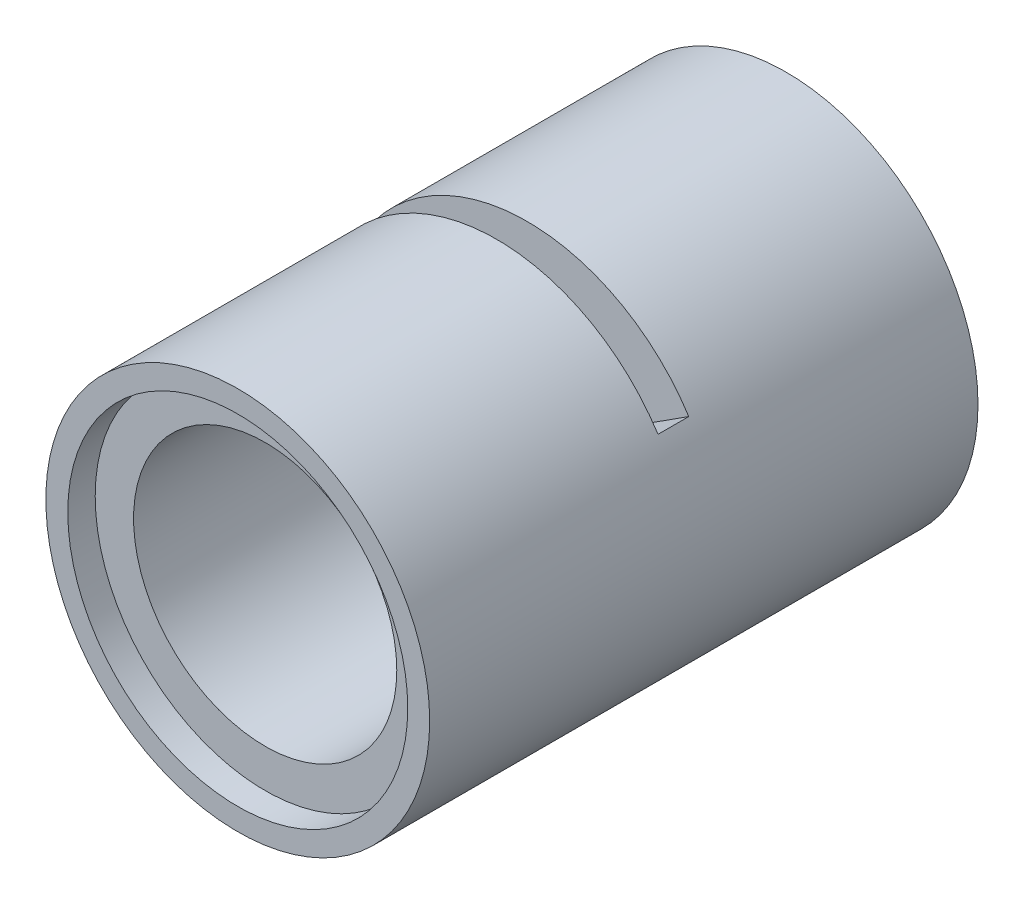
ISO-10303-21;
HEADER;
FILE_DESCRIPTION(('STEP AP214'),'2;1');
FILE_NAME('part.step','',(''),(''),'','','');
FILE_SCHEMA(('AUTOMOTIVE_DESIGN { 1 0 10303 214 1 1 1 1 }'));
ENDSEC;
DATA;
#1=APPLICATION_CONTEXT('core data for automotive mechanical design processes');
#2=APPLICATION_PROTOCOL_DEFINITION('international standard','automotive_design',2000,#1);
#3=PRODUCT_CONTEXT('',#1,'mechanical');
#4=PRODUCT('Part','Part','',(#3));
#5=PRODUCT_RELATED_PRODUCT_CATEGORY('part','',(#4));
#6=PRODUCT_DEFINITION_FORMATION('','',#4);
#7=PRODUCT_DEFINITION_CONTEXT('part definition',#1,'design');
#8=PRODUCT_DEFINITION('design','',#6,#7);
#9=PRODUCT_DEFINITION_SHAPE('','',#8);
#10=(LENGTH_UNIT() NAMED_UNIT(*) SI_UNIT(.MILLI.,.METRE.));
#11=(NAMED_UNIT(*) PLANE_ANGLE_UNIT() SI_UNIT($,.RADIAN.));
#12=(NAMED_UNIT(*) SI_UNIT($,.STERADIAN.) SOLID_ANGLE_UNIT());
#13=UNCERTAINTY_MEASURE_WITH_UNIT(LENGTH_MEASURE(1.E-05),#10,'distance_accuracy_value','');
#14=(GEOMETRIC_REPRESENTATION_CONTEXT(3) GLOBAL_UNCERTAINTY_ASSIGNED_CONTEXT((#13)) GLOBAL_UNIT_ASSIGNED_CONTEXT((#10,
#11,#12)) REPRESENTATION_CONTEXT('',''));
#15=CARTESIAN_POINT('',(0.,0.,0.));
#16=DIRECTION('',(0.,0.,1.));
#17=DIRECTION('',(1.,0.,0.));
#18=AXIS2_PLACEMENT_3D('',#15,#16,#17);
#19=CARTESIAN_POINT('',(0.,0.,0.));
#20=DIRECTION('',(0.,0.,1.));
#21=DIRECTION('',(1.,0.,0.));
#22=AXIS2_PLACEMENT_3D('',#19,#20,#21);
#23=CYLINDRICAL_SURFACE('',#22,2.4);
#24=CARTESIAN_POINT('',(0.,0.,9.5));
#25=DIRECTION('',(0.,0.,1.));
#26=DIRECTION('',(1.,0.,0.));
#27=AXIS2_PLACEMENT_3D('',#24,#25,#26);
#28=CIRCLE('',#27,2.4);
#29=CARTESIAN_POINT('',(2.4,0.,9.5));
#30=VERTEX_POINT('',#29);
#31=EDGE_CURVE('E146',#30,#30,#28,.F.);
#32=ORIENTED_EDGE('',*,*,#31,.F.);
#33=EDGE_LOOP('',(#32));
#34=FACE_BOUND('',#33,.T.);
#35=CARTESIAN_POINT('',(0.,0.,0.5));
#36=DIRECTION('',(0.,0.,-1.));
#37=DIRECTION('',(-1.,0.,0.));
#38=AXIS2_PLACEMENT_3D('',#35,#36,#37);
#39=CIRCLE('',#38,2.4);
#40=CARTESIAN_POINT('',(-2.4,0.,0.5));
#41=VERTEX_POINT('',#40);
#42=EDGE_CURVE('E63',#41,#41,#39,.F.);
#43=ORIENTED_EDGE('',*,*,#42,.F.);
#44=EDGE_LOOP('',(#43));
#45=FACE_BOUND('',#44,.T.);
#46=ADVANCED_FACE('F59',(#34,#45),#23,.F.);
#47=CARTESIAN_POINT('',(0.,0.,10.));
#48=DIRECTION('',(0.,0.,-1.));
#49=DIRECTION('',(-1.,0.,0.));
#50=AXIS2_PLACEMENT_3D('',#47,#48,#49);
#51=CYLINDRICAL_SURFACE('',#50,3.5);
#52=CARTESIAN_POINT('',(0.,0.,5.28033941216112));
#53=DIRECTION('',(0.,0.,-1.));
#54=DIRECTION('',(0.841470984807896,0.54030230586814,0.));
#55=AXIS2_PLACEMENT_3D('',#52,#53,#54);
#56=CIRCLE('',#55,3.5);
#57=CARTESIAN_POINT('',(-2.94514844682764,1.89105807053849,5.28033941216112));
#58=VERTEX_POINT('',#57);
#59=CARTESIAN_POINT('',(2.94514844682764,1.89105807053849,5.28033941216112));
#60=VERTEX_POINT('',#59);
#61=EDGE_CURVE('E106',#58,#60,#56,.T.);
#62=ORIENTED_EDGE('',*,*,#61,.F.);
#63=DIRECTION('',(0.,0.,1.));
#64=VECTOR('',#63,1.);
#65=CARTESIAN_POINT('',(-2.94514844682764,1.89105807053849,4.71966058783888));
#66=LINE('',#65,#64);
#67=CARTESIAN_POINT('',(-2.94514844682764,1.89105807053849,4.71966058783888));
#68=VERTEX_POINT('',#67);
#69=EDGE_CURVE('E206',#68,#58,#66,.T.);
#70=ORIENTED_EDGE('',*,*,#69,.F.);
#71=CARTESIAN_POINT('',(0.,0.,4.71966058783888));
#72=DIRECTION('',(0.,0.,-1.));
#73=DIRECTION('',(0.841470984807896,0.54030230586814,0.));
#74=AXIS2_PLACEMENT_3D('',#71,#72,#73);
#75=CIRCLE('',#74,3.5);
#76=CARTESIAN_POINT('',(2.94514844682764,1.89105807053849,4.71966058783888));
#77=VERTEX_POINT('',#76);
#78=EDGE_CURVE('E212',#68,#77,#75,.T.);
#79=ORIENTED_EDGE('',*,*,#78,.T.);
#80=DIRECTION('',(0.,0.,-1.));
#81=VECTOR('',#80,1.);
#82=CARTESIAN_POINT('',(2.94514844682764,1.89105807053849,5.28033941216112));
#83=LINE('',#82,#81);
#84=EDGE_CURVE('E76',#60,#77,#83,.T.);
#85=ORIENTED_EDGE('',*,*,#84,.F.);
#86=EDGE_LOOP('',(#62,#70,#79,#85));
#87=FACE_BOUND('',#86,.T.);
#88=CARTESIAN_POINT('',(0.,0.,10.));
#89=DIRECTION('',(0.,0.,1.));
#90=DIRECTION('',(1.,0.,0.));
#91=AXIS2_PLACEMENT_3D('',#88,#89,#90);
#92=CIRCLE('',#91,3.5);
#93=CARTESIAN_POINT('',(3.5,0.,10.));
#94=VERTEX_POINT('',#93);
#95=EDGE_CURVE('E13',#94,#94,#92,.T.);
#96=ORIENTED_EDGE('',*,*,#95,.F.);
#97=EDGE_LOOP('',(#96));
#98=FACE_BOUND('',#97,.T.);
#99=CARTESIAN_POINT('',(0.,0.,0.));
#100=DIRECTION('',(0.,0.,1.));
#101=DIRECTION('',(1.,0.,0.));
#102=AXIS2_PLACEMENT_3D('',#99,#100,#101);
#103=CIRCLE('',#102,3.5);
#104=CARTESIAN_POINT('',(3.5,0.,0.));
#105=VERTEX_POINT('',#104);
#106=EDGE_CURVE('E68',#105,#105,#103,.T.);
#107=ORIENTED_EDGE('',*,*,#106,.T.);
#108=EDGE_LOOP('',(#107));
#109=FACE_BOUND('',#108,.T.);
#110=ADVANCED_FACE('F61',(#87,#98,#109),#51,.T.);
#111=CARTESIAN_POINT('',(0.,0.,10.));
#112=DIRECTION('',(0.,0.,1.));
#113=DIRECTION('',(1.,0.,0.));
#114=AXIS2_PLACEMENT_3D('',#111,#112,#113);
#115=PLANE('',#114);
#116=CARTESIAN_POINT('',(0.,0.,10.));
#117=DIRECTION('',(0.,0.,1.));
#118=DIRECTION('',(1.,0.,0.));
#119=AXIS2_PLACEMENT_3D('',#116,#117,#118);
#120=CIRCLE('',#119,3.1);
#121=CARTESIAN_POINT('',(3.1,0.,10.));
#122=VERTEX_POINT('',#121);
#123=EDGE_CURVE('E147',#122,#122,#120,.T.);
#124=ORIENTED_EDGE('',*,*,#123,.F.);
#125=EDGE_LOOP('',(#124));
#126=FACE_BOUND('',#125,.T.);
#127=ORIENTED_EDGE('',*,*,#95,.T.);
#128=EDGE_LOOP('',(#127));
#129=FACE_BOUND('',#128,.T.);
#130=ADVANCED_FACE('F185',(#126,#129),#115,.T.);
#131=CARTESIAN_POINT('',(0.,0.,0.));
#132=DIRECTION('',(0.,0.,1.));
#133=DIRECTION('',(1.,0.,0.));
#134=AXIS2_PLACEMENT_3D('',#131,#132,#133);
#135=PLANE('',#134);
#136=CARTESIAN_POINT('',(0.,0.,0.));
#137=DIRECTION('',(0.,0.,1.));
#138=DIRECTION('',(1.,0.,0.));
#139=AXIS2_PLACEMENT_3D('',#136,#137,#138);
#140=CIRCLE('',#139,3.1);
#141=CARTESIAN_POINT('',(3.1,0.,0.));
#142=VERTEX_POINT('',#141);
#143=EDGE_CURVE('E136',#142,#142,#140,.T.);
#144=ORIENTED_EDGE('',*,*,#143,.T.);
#145=EDGE_LOOP('',(#144));
#146=FACE_BOUND('',#145,.T.);
#147=ORIENTED_EDGE('',*,*,#106,.F.);
#148=EDGE_LOOP('',(#147));
#149=FACE_BOUND('',#148,.T.);
#150=ADVANCED_FACE('F182',(#146,#149),#135,.F.);
#151=CARTESIAN_POINT('',(0.,0.,9.5));
#152=DIRECTION('',(0.,0.,1.));
#153=DIRECTION('',(1.,0.,0.));
#154=AXIS2_PLACEMENT_3D('',#151,#152,#153);
#155=PLANE('',#154);
#156=CARTESIAN_POINT('',(0.,0.,9.5));
#157=DIRECTION('',(0.,0.,1.));
#158=DIRECTION('',(1.,0.,0.));
#159=AXIS2_PLACEMENT_3D('',#156,#157,#158);
#160=CIRCLE('',#159,3.1);
#161=CARTESIAN_POINT('',(3.1,0.,9.5));
#162=VERTEX_POINT('',#161);
#163=EDGE_CURVE('E143',#162,#162,#160,.T.);
#164=ORIENTED_EDGE('',*,*,#163,.T.);
#165=EDGE_LOOP('',(#164));
#166=FACE_BOUND('',#165,.T.);
#167=ORIENTED_EDGE('',*,*,#31,.T.);
#168=EDGE_LOOP('',(#167));
#169=FACE_BOUND('',#168,.T.);
#170=ADVANCED_FACE('F154',(#166,#169),#155,.T.);
#171=CARTESIAN_POINT('',(0.,0.,9.5));
#172=DIRECTION('',(0.,0.,1.));
#173=DIRECTION('',(1.,0.,0.));
#174=AXIS2_PLACEMENT_3D('',#171,#172,#173);
#175=CYLINDRICAL_SURFACE('',#174,3.1);
#176=ORIENTED_EDGE('',*,*,#163,.F.);
#177=EDGE_LOOP('',(#176));
#178=FACE_BOUND('',#177,.T.);
#179=ORIENTED_EDGE('',*,*,#123,.T.);
#180=EDGE_LOOP('',(#179));
#181=FACE_BOUND('',#180,.T.);
#182=ADVANCED_FACE('F165',(#178,#181),#175,.F.);
#183=CARTESIAN_POINT('',(0.,0.,0.5));
#184=DIRECTION('',(0.,0.,-1.));
#185=DIRECTION('',(1.,0.,0.));
#186=AXIS2_PLACEMENT_3D('',#183,#184,#185);
#187=PLANE('',#186);
#188=CARTESIAN_POINT('',(0.,0.,0.5));
#189=DIRECTION('',(0.,0.,1.));
#190=DIRECTION('',(1.,0.,0.));
#191=AXIS2_PLACEMENT_3D('',#188,#189,#190);
#192=CIRCLE('',#191,3.1);
#193=CARTESIAN_POINT('',(3.1,0.,0.5));
#194=VERTEX_POINT('',#193);
#195=EDGE_CURVE('E138',#194,#194,#192,.T.);
#196=ORIENTED_EDGE('',*,*,#195,.F.);
#197=EDGE_LOOP('',(#196));
#198=FACE_BOUND('',#197,.T.);
#199=ORIENTED_EDGE('',*,*,#42,.T.);
#200=EDGE_LOOP('',(#199));
#201=FACE_BOUND('',#200,.T.);
#202=ADVANCED_FACE('F162',(#198,#201),#187,.T.);
#203=CARTESIAN_POINT('',(0.,0.,0.5));
#204=DIRECTION('',(0.,0.,-1.));
#205=DIRECTION('',(-1.,0.,0.));
#206=AXIS2_PLACEMENT_3D('',#203,#204,#205);
#207=CYLINDRICAL_SURFACE('',#206,3.1);
#208=ORIENTED_EDGE('',*,*,#195,.T.);
#209=EDGE_LOOP('',(#208));
#210=FACE_BOUND('',#209,.T.);
#211=ORIENTED_EDGE('',*,*,#143,.F.);
#212=EDGE_LOOP('',(#211));
#213=FACE_BOUND('',#212,.T.);
#214=ADVANCED_FACE('F164',(#210,#213),#207,.F.);
#215=CARTESIAN_POINT('',(-2.94514844682764,1.89105807053849,5.));
#216=DIRECTION('',(-0.540302305868139,-0.841470984807897,0.));
#217=DIRECTION('',(0.,0.,1.));
#218=AXIS2_PLACEMENT_3D('',#215,#216,#217);
#219=PLANE('',#218);
#220=DIRECTION('',(-0.841470984807897,0.540302305868139,0.));
#221=VECTOR('',#220,1.);
#222=CARTESIAN_POINT('',(-2.94514844682764,1.89105807053849,4.71966058783888));
#223=LINE('',#222,#221);
#224=CARTESIAN_POINT('',(-2.10367746201974,1.35075576467035,4.71966058783888));
#225=VERTEX_POINT('',#224);
#226=EDGE_CURVE('E112',#225,#68,#223,.T.);
#227=ORIENTED_EDGE('',*,*,#226,.T.);
#228=ORIENTED_EDGE('',*,*,#69,.T.);
#229=DIRECTION('',(-0.841470984807897,0.540302305868139,0.));
#230=VECTOR('',#229,1.);
#231=CARTESIAN_POINT('',(-2.94514844682764,1.89105807053849,5.28033941216112));
#232=LINE('',#231,#230);
#233=CARTESIAN_POINT('',(-2.10367746201974,1.35075576467035,5.28033941216112));
#234=VERTEX_POINT('',#233);
#235=EDGE_CURVE('E134',#234,#58,#232,.T.);
#236=ORIENTED_EDGE('',*,*,#235,.F.);
#237=DIRECTION('',(0.,0.,-1.));
#238=VECTOR('',#237,1.);
#239=CARTESIAN_POINT('',(-2.10367746201974,1.35075576467035,10.));
#240=LINE('',#239,#238);
#241=EDGE_CURVE('E117',#225,#234,#240,.F.);
#242=ORIENTED_EDGE('',*,*,#241,.F.);
#243=EDGE_LOOP('',(#227,#228,#236,#242));
#244=FACE_BOUND('',#243,.T.);
#245=ADVANCED_FACE('F172',(#244),#219,.F.);
#246=CARTESIAN_POINT('',(0.,0.,5.28033941216112));
#247=DIRECTION('',(0.,0.,1.));
#248=DIRECTION('',(1.,0.,0.));
#249=AXIS2_PLACEMENT_3D('',#246,#247,#248);
#250=PLANE('',#249);
#251=ORIENTED_EDGE('',*,*,#235,.T.);
#252=ORIENTED_EDGE('',*,*,#61,.T.);
#253=DIRECTION('',(0.841470984807896,0.54030230586814,0.));
#254=VECTOR('',#253,1.);
#255=CARTESIAN_POINT('',(2.94514844682764,1.89105807053849,5.28033941216112));
#256=LINE('',#255,#254);
#257=CARTESIAN_POINT('',(2.10367746201974,1.35075576467035,5.28033941216112));
#258=VERTEX_POINT('',#257);
#259=EDGE_CURVE('E82',#258,#60,#256,.T.);
#260=ORIENTED_EDGE('',*,*,#259,.F.);
#261=CARTESIAN_POINT('',(0.,0.,5.28033941216112));
#262=DIRECTION('',(0.,0.,-1.));
#263=DIRECTION('',(-1.,0.,0.));
#264=AXIS2_PLACEMENT_3D('',#261,#262,#263);
#265=CIRCLE('',#264,2.5);
#266=EDGE_CURVE('E121',#234,#258,#265,.T.);
#267=ORIENTED_EDGE('',*,*,#266,.F.);
#268=EDGE_LOOP('',(#251,#252,#260,#267));
#269=FACE_BOUND('',#268,.T.);
#270=ADVANCED_FACE('F228',(#269),#250,.F.);
#271=CARTESIAN_POINT('',(2.94514844682764,1.89105807053849,5.));
#272=DIRECTION('',(0.54030230586814,-0.841470984807896,0.));
#273=DIRECTION('',(0.,0.,-1.));
#274=AXIS2_PLACEMENT_3D('',#271,#272,#273);
#275=PLANE('',#274);
#276=ORIENTED_EDGE('',*,*,#259,.T.);
#277=ORIENTED_EDGE('',*,*,#84,.T.);
#278=DIRECTION('',(0.841470984807896,0.54030230586814,0.));
#279=VECTOR('',#278,1.);
#280=CARTESIAN_POINT('',(2.94514844682764,1.89105807053849,4.71966058783888));
#281=LINE('',#280,#279);
#282=CARTESIAN_POINT('',(2.10367746201974,1.35075576467035,4.71966058783888));
#283=VERTEX_POINT('',#282);
#284=EDGE_CURVE('E97',#283,#77,#281,.T.);
#285=ORIENTED_EDGE('',*,*,#284,.F.);
#286=DIRECTION('',(0.,0.,-1.));
#287=VECTOR('',#286,1.);
#288=CARTESIAN_POINT('',(2.10367746201974,1.35075576467035,10.));
#289=LINE('',#288,#287);
#290=EDGE_CURVE('E101',#258,#283,#289,.T.);
#291=ORIENTED_EDGE('',*,*,#290,.F.);
#292=EDGE_LOOP('',(#276,#277,#285,#291));
#293=FACE_BOUND('',#292,.T.);
#294=ADVANCED_FACE('F99',(#293),#275,.F.);
#295=CARTESIAN_POINT('',(0.,0.,4.71966058783888));
#296=DIRECTION('',(0.,0.,1.));
#297=DIRECTION('',(1.,0.,0.));
#298=AXIS2_PLACEMENT_3D('',#295,#296,#297);
#299=PLANE('',#298);
#300=CARTESIAN_POINT('',(0.,0.,4.71966058783888));
#301=DIRECTION('',(0.,0.,-1.));
#302=DIRECTION('',(-1.,0.,0.));
#303=AXIS2_PLACEMENT_3D('',#300,#301,#302);
#304=CIRCLE('',#303,2.5);
#305=EDGE_CURVE('E109',#225,#283,#304,.T.);
#306=ORIENTED_EDGE('',*,*,#305,.T.);
#307=ORIENTED_EDGE('',*,*,#284,.T.);
#308=ORIENTED_EDGE('',*,*,#78,.F.);
#309=ORIENTED_EDGE('',*,*,#226,.F.);
#310=EDGE_LOOP('',(#306,#307,#308,#309));
#311=FACE_BOUND('',#310,.T.);
#312=ADVANCED_FACE('F110',(#311),#299,.T.);
#313=CARTESIAN_POINT('',(0.,0.,10.));
#314=DIRECTION('',(0.,0.,-1.));
#315=DIRECTION('',(-1.,0.,0.));
#316=AXIS2_PLACEMENT_3D('',#313,#314,#315);
#317=CYLINDRICAL_SURFACE('',#316,2.5);
#318=ORIENTED_EDGE('',*,*,#290,.T.);
#319=ORIENTED_EDGE('',*,*,#305,.F.);
#320=ORIENTED_EDGE('',*,*,#241,.T.);
#321=ORIENTED_EDGE('',*,*,#266,.T.);
#322=EDGE_LOOP('',(#318,#319,#320,#321));
#323=FACE_BOUND('',#322,.T.);
#324=ADVANCED_FACE('F119',(#323),#317,.T.);
#325=CLOSED_SHELL('',(#46,#110,#130,#150,#170,#182,#202,#214,#245,#270,#294,#312,#324));
#326=MANIFOLD_SOLID_BREP('B2',#325);
#327=ADVANCED_BREP_SHAPE_REPRESENTATION('',(#18,#326),#14);
#328=SHAPE_DEFINITION_REPRESENTATION(#9,#327);
ENDSEC;
END-ISO-10303-21;
